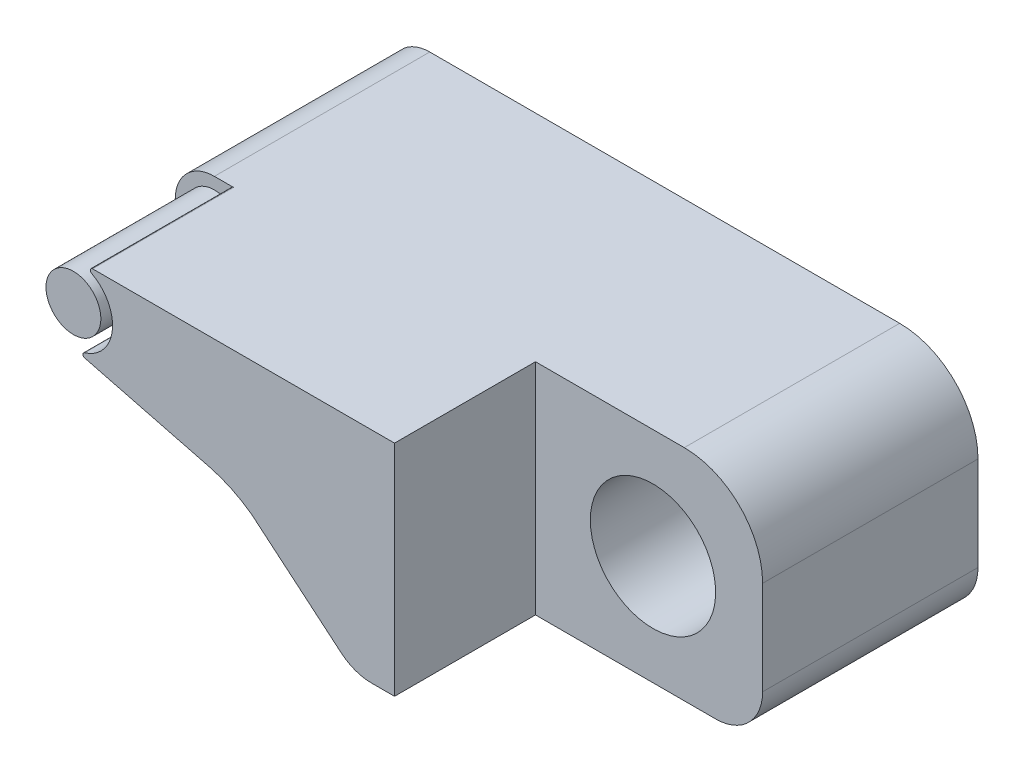
ISO-10303-21;
HEADER;
FILE_DESCRIPTION(('STEP AP214'),'2;1');
FILE_NAME('part.step','',(''),(''),'','','');
FILE_SCHEMA(('AUTOMOTIVE_DESIGN { 1 0 10303 214 1 1 1 1 }'));
ENDSEC;
DATA;
#1=APPLICATION_CONTEXT('core data for automotive mechanical design processes');
#2=APPLICATION_PROTOCOL_DEFINITION('international standard','automotive_design',2000,#1);
#3=PRODUCT_CONTEXT('',#1,'mechanical');
#4=PRODUCT('Part','Part','',(#3));
#5=PRODUCT_RELATED_PRODUCT_CATEGORY('part','',(#4));
#6=PRODUCT_DEFINITION_FORMATION('','',#4);
#7=PRODUCT_DEFINITION_CONTEXT('part definition',#1,'design');
#8=PRODUCT_DEFINITION('design','',#6,#7);
#9=PRODUCT_DEFINITION_SHAPE('','',#8);
#10=(LENGTH_UNIT() NAMED_UNIT(*) SI_UNIT(.MILLI.,.METRE.));
#11=(NAMED_UNIT(*) PLANE_ANGLE_UNIT() SI_UNIT($,.RADIAN.));
#12=(NAMED_UNIT(*) SI_UNIT($,.STERADIAN.) SOLID_ANGLE_UNIT());
#13=UNCERTAINTY_MEASURE_WITH_UNIT(LENGTH_MEASURE(1.E-05),#10,'distance_accuracy_value','');
#14=(GEOMETRIC_REPRESENTATION_CONTEXT(3) GLOBAL_UNCERTAINTY_ASSIGNED_CONTEXT((#13)) GLOBAL_UNIT_ASSIGNED_CONTEXT((#10,
#11,#12)) REPRESENTATION_CONTEXT('',''));
#15=CARTESIAN_POINT('',(0.,0.,0.));
#16=DIRECTION('',(0.,0.,1.));
#17=DIRECTION('',(1.,0.,0.));
#18=AXIS2_PLACEMENT_3D('',#15,#16,#17);
#19=CARTESIAN_POINT('',(-82.6571780570874,-15.9329559710716,-48.5));
#20=DIRECTION('',(0.,0.,1.));
#21=DIRECTION('',(-1.,0.,0.));
#22=AXIS2_PLACEMENT_3D('',#19,#20,#21);
#23=CYLINDRICAL_SURFACE('',#22,16.);
#24=DIRECTION('',(0.,0.,1.));
#25=VECTOR('',#24,1.);
#26=CARTESIAN_POINT('',(-73.2663944291931,-2.97868320668711,-48.5));
#27=LINE('',#26,#25);
#28=CARTESIAN_POINT('',(-73.2663944291931,-2.97868320668711,-27.5));
#29=VERTEX_POINT('',#28);
#30=CARTESIAN_POINT('',(-73.2663944291931,-2.9786832066871,18.));
#31=VERTEX_POINT('',#30);
#32=EDGE_CURVE('E176',#29,#31,#27,.T.);
#33=ORIENTED_EDGE('',*,*,#32,.T.);
#34=CARTESIAN_POINT('',(-82.6571780570874,-15.9329559710716,18.));
#35=DIRECTION('',(0.,0.,-1.));
#36=DIRECTION('',(-1.,0.,0.));
#37=AXIS2_PLACEMENT_3D('',#34,#35,#36);
#38=CIRCLE('',#37,16.);
#39=CARTESIAN_POINT('',(-78.6881101146584,-0.43306888540599,18.));
#40=VERTEX_POINT('',#39);
#41=EDGE_CURVE('E242',#31,#40,#38,.F.);
#42=ORIENTED_EDGE('',*,*,#41,.T.);
#43=DIRECTION('',(0.,0.,1.));
#44=VECTOR('',#43,1.);
#45=CARTESIAN_POINT('',(-78.6881101146584,-0.433068885405992,-48.5));
#46=LINE('',#45,#44);
#47=CARTESIAN_POINT('',(-78.6881101146584,-0.433068885405992,-27.5));
#48=VERTEX_POINT('',#47);
#49=EDGE_CURVE('E178',#48,#40,#46,.T.);
#50=ORIENTED_EDGE('',*,*,#49,.F.);
#51=CARTESIAN_POINT('',(-82.6571780570874,-15.9329559710716,-27.5));
#52=DIRECTION('',(0.,0.,-1.));
#53=DIRECTION('',(1.,0.,0.));
#54=AXIS2_PLACEMENT_3D('',#51,#52,#53);
#55=CIRCLE('',#54,16.);
#56=EDGE_CURVE('E164',#48,#29,#55,.T.);
#57=ORIENTED_EDGE('',*,*,#56,.T.);
#58=EDGE_LOOP('',(#33,#42,#50,#57));
#59=FACE_BOUND('',#58,.T.);
#60=ADVANCED_FACE('F45',(#59),#23,.F.);
#61=CARTESIAN_POINT('',(-55.2115879873631,-18.1284646330034,-48.5));
#62=DIRECTION('',(0.642787609686529,0.766044443118987,0.));
#63=DIRECTION('',(0.766044443118987,-0.642787609686529,0.));
#64=AXIS2_PLACEMENT_3D('',#61,#62,#63);
#65=PLANE('',#64);
#66=DIRECTION('',(0.,0.,1.));
#67=VECTOR('',#66,1.);
#68=CARTESIAN_POINT('',(-61.8046047981652,-12.5962666587139,-48.5));
#69=LINE('',#68,#67);
#70=CARTESIAN_POINT('',(-61.8046047981652,-12.5962666587139,-27.5));
#71=VERTEX_POINT('',#70);
#72=CARTESIAN_POINT('',(-61.8046047981652,-12.5962666587139,18.));
#73=VERTEX_POINT('',#72);
#74=EDGE_CURVE('E185',#71,#73,#69,.T.);
#75=ORIENTED_EDGE('',*,*,#74,.T.);
#76=DIRECTION('',(-0.766044443118987,0.642787609686528,0.));
#77=VECTOR('',#76,1.);
#78=CARTESIAN_POINT('',(-55.2115879873631,-18.1284646330034,18.));
#79=LINE('',#78,#77);
#80=EDGE_CURVE('E182',#73,#31,#79,.T.);
#81=ORIENTED_EDGE('',*,*,#80,.T.);
#82=ORIENTED_EDGE('',*,*,#32,.F.);
#83=DIRECTION('',(0.766044443118987,-0.642787609686528,0.));
#84=VECTOR('',#83,1.);
#85=CARTESIAN_POINT('',(-73.2663944291931,-2.97868320668711,-27.5));
#86=LINE('',#85,#84);
#87=EDGE_CURVE('E161',#29,#71,#86,.T.);
#88=ORIENTED_EDGE('',*,*,#87,.T.);
#89=EDGE_LOOP('',(#75,#81,#82,#88));
#90=FACE_BOUND('',#89,.T.);
#91=ADVANCED_FACE('F180',(#90),#65,.F.);
#92=CARTESIAN_POINT('',(-57.947879140046,-8.,-48.5));
#93=DIRECTION('',(0.,0.,1.));
#94=DIRECTION('',(-1.,0.,0.));
#95=AXIS2_PLACEMENT_3D('',#92,#93,#94);
#96=CYLINDRICAL_SURFACE('',#95,6.);
#97=DIRECTION('',(0.,0.,1.));
#98=VECTOR('',#97,1.);
#99=CARTESIAN_POINT('',(-57.947879140046,-14.,-48.5));
#100=LINE('',#99,#98);
#101=CARTESIAN_POINT('',(-57.947879140046,-14.,-27.5));
#102=VERTEX_POINT('',#101);
#103=CARTESIAN_POINT('',(-57.947879140046,-14.,18.));
#104=VERTEX_POINT('',#103);
#105=EDGE_CURVE('E190',#102,#104,#100,.T.);
#106=ORIENTED_EDGE('',*,*,#105,.T.);
#107=CARTESIAN_POINT('',(-57.947879140046,-8.,18.));
#108=DIRECTION('',(0.,0.,-1.));
#109=DIRECTION('',(-1.,0.,0.));
#110=AXIS2_PLACEMENT_3D('',#107,#108,#109);
#111=CIRCLE('',#110,6.);
#112=EDGE_CURVE('E308',#104,#73,#111,.T.);
#113=ORIENTED_EDGE('',*,*,#112,.T.);
#114=ORIENTED_EDGE('',*,*,#74,.F.);
#115=CARTESIAN_POINT('',(-57.947879140046,-8.,-27.5));
#116=DIRECTION('',(0.,0.,1.));
#117=DIRECTION('',(1.,0.,0.));
#118=AXIS2_PLACEMENT_3D('',#115,#116,#117);
#119=CIRCLE('',#118,6.);
#120=EDGE_CURVE('E167',#71,#102,#119,.T.);
#121=ORIENTED_EDGE('',*,*,#120,.T.);
#122=EDGE_LOOP('',(#106,#113,#114,#121));
#123=FACE_BOUND('',#122,.T.);
#124=ADVANCED_FACE('F311',(#123),#96,.T.);
#125=CARTESIAN_POINT('',(-40.,-14.,-48.5));
#126=DIRECTION('',(0.,1.,0.));
#127=DIRECTION('',(0.,0.,1.));
#128=AXIS2_PLACEMENT_3D('',#125,#126,#127);
#129=PLANE('',#128);
#130=DIRECTION('',(0.,0.,1.));
#131=VECTOR('',#130,1.);
#132=CARTESIAN_POINT('',(-32.,-14.,-48.5));
#133=LINE('',#132,#131);
#134=CARTESIAN_POINT('',(-32.,-14.,-27.5));
#135=VERTEX_POINT('',#134);
#136=CARTESIAN_POINT('',(-32.,-14.,0.));
#137=VERTEX_POINT('',#136);
#138=EDGE_CURVE('E198',#135,#137,#133,.T.);
#139=ORIENTED_EDGE('',*,*,#138,.T.);
#140=DIRECTION('',(1.,0.,0.));
#141=VECTOR('',#140,1.);
#142=CARTESIAN_POINT('',(-40.,-14.,0.));
#143=LINE('',#142,#141);
#144=CARTESIAN_POINT('',(-55.,-14.,0.));
#145=VERTEX_POINT('',#144);
#146=EDGE_CURVE('E270',#145,#137,#143,.T.);
#147=ORIENTED_EDGE('',*,*,#146,.F.);
#148=DIRECTION('',(0.,0.,-1.));
#149=VECTOR('',#148,1.);
#150=CARTESIAN_POINT('',(-55.,-14.,18.));
#151=LINE('',#150,#149);
#152=CARTESIAN_POINT('',(-55.,-14.,18.));
#153=VERTEX_POINT('',#152);
#154=EDGE_CURVE('E241',#153,#145,#151,.T.);
#155=ORIENTED_EDGE('',*,*,#154,.F.);
#156=DIRECTION('',(-1.,0.,0.));
#157=VECTOR('',#156,1.);
#158=CARTESIAN_POINT('',(-40.,-14.,18.));
#159=LINE('',#158,#157);
#160=EDGE_CURVE('E306',#153,#104,#159,.T.);
#161=ORIENTED_EDGE('',*,*,#160,.T.);
#162=ORIENTED_EDGE('',*,*,#105,.F.);
#163=DIRECTION('',(1.,0.,0.));
#164=VECTOR('',#163,1.);
#165=CARTESIAN_POINT('',(-57.947879140046,-14.,-27.5));
#166=LINE('',#165,#164);
#167=EDGE_CURVE('E591',#102,#135,#166,.T.);
#168=ORIENTED_EDGE('',*,*,#167,.T.);
#169=EDGE_LOOP('',(#139,#147,#155,#161,#162,#168));
#170=FACE_BOUND('',#169,.T.);
#171=ADVANCED_FACE('F475',(#170),#129,.F.);
#172=CARTESIAN_POINT('',(-32.,-8.,-48.5));
#173=DIRECTION('',(0.,0.,1.));
#174=DIRECTION('',(-1.,0.,0.));
#175=AXIS2_PLACEMENT_3D('',#172,#173,#174);
#176=CYLINDRICAL_SURFACE('',#175,6.);
#177=DIRECTION('',(0.,0.,1.));
#178=VECTOR('',#177,1.);
#179=CARTESIAN_POINT('',(-26.,-8.,-48.5));
#180=LINE('',#179,#178);
#181=CARTESIAN_POINT('',(-26.,-8.,-27.5));
#182=VERTEX_POINT('',#181);
#183=CARTESIAN_POINT('',(-26.,-8.,0.));
#184=VERTEX_POINT('',#183);
#185=EDGE_CURVE('E201',#182,#184,#180,.T.);
#186=ORIENTED_EDGE('',*,*,#185,.T.);
#187=CARTESIAN_POINT('',(-32.,-8.,0.));
#188=DIRECTION('',(0.,0.,-1.));
#189=DIRECTION('',(-1.,0.,0.));
#190=AXIS2_PLACEMENT_3D('',#187,#188,#189);
#191=CIRCLE('',#190,6.);
#192=EDGE_CURVE('E268',#137,#184,#191,.F.);
#193=ORIENTED_EDGE('',*,*,#192,.F.);
#194=ORIENTED_EDGE('',*,*,#138,.F.);
#195=CARTESIAN_POINT('',(-32.,-8.,-27.5));
#196=DIRECTION('',(0.,0.,1.));
#197=DIRECTION('',(1.,0.,0.));
#198=AXIS2_PLACEMENT_3D('',#195,#196,#197);
#199=CIRCLE('',#198,6.);
#200=EDGE_CURVE('E593',#135,#182,#199,.T.);
#201=ORIENTED_EDGE('',*,*,#200,.T.);
#202=EDGE_LOOP('',(#186,#193,#194,#201));
#203=FACE_BOUND('',#202,.T.);
#204=ADVANCED_FACE('F466',(#203),#176,.T.);
#205=CARTESIAN_POINT('',(-26.,0.,-48.5));
#206=DIRECTION('',(-1.,0.,0.));
#207=DIRECTION('',(0.,1.,0.));
#208=AXIS2_PLACEMENT_3D('',#205,#206,#207);
#209=PLANE('',#208);
#210=DIRECTION('',(0.,0.,1.));
#211=VECTOR('',#210,1.);
#212=CARTESIAN_POINT('',(-26.,4.,-48.5));
#213=LINE('',#212,#211);
#214=CARTESIAN_POINT('',(-26.,4.,-27.5));
#215=VERTEX_POINT('',#214);
#216=CARTESIAN_POINT('',(-26.,4.,0.));
#217=VERTEX_POINT('',#216);
#218=EDGE_CURVE('E204',#215,#217,#213,.T.);
#219=ORIENTED_EDGE('',*,*,#218,.T.);
#220=DIRECTION('',(0.,1.,0.));
#221=VECTOR('',#220,1.);
#222=CARTESIAN_POINT('',(-26.,0.,0.));
#223=LINE('',#222,#221);
#224=EDGE_CURVE('E265',#184,#217,#223,.T.);
#225=ORIENTED_EDGE('',*,*,#224,.F.);
#226=ORIENTED_EDGE('',*,*,#185,.F.);
#227=DIRECTION('',(0.,1.,0.));
#228=VECTOR('',#227,1.);
#229=CARTESIAN_POINT('',(-26.,-8.,-27.5));
#230=LINE('',#229,#228);
#231=EDGE_CURVE('E597',#182,#215,#230,.T.);
#232=ORIENTED_EDGE('',*,*,#231,.T.);
#233=EDGE_LOOP('',(#219,#225,#226,#232));
#234=FACE_BOUND('',#233,.T.);
#235=ADVANCED_FACE('F456',(#234),#209,.F.);
#236=CARTESIAN_POINT('',(-36.,4.,-48.5));
#237=DIRECTION('',(0.,0.,1.));
#238=DIRECTION('',(-1.,0.,0.));
#239=AXIS2_PLACEMENT_3D('',#236,#237,#238);
#240=CYLINDRICAL_SURFACE('',#239,10.);
#241=DIRECTION('',(0.,0.,1.));
#242=VECTOR('',#241,1.);
#243=CARTESIAN_POINT('',(-36.,14.,-48.5));
#244=LINE('',#243,#242);
#245=CARTESIAN_POINT('',(-36.,14.,-27.5));
#246=VERTEX_POINT('',#245);
#247=CARTESIAN_POINT('',(-36.,14.,0.));
#248=VERTEX_POINT('',#247);
#249=EDGE_CURVE('E207',#246,#248,#244,.T.);
#250=ORIENTED_EDGE('',*,*,#249,.T.);
#251=CARTESIAN_POINT('',(-36.,4.,0.));
#252=DIRECTION('',(0.,0.,-1.));
#253=DIRECTION('',(-1.,0.,0.));
#254=AXIS2_PLACEMENT_3D('',#251,#252,#253);
#255=CIRCLE('',#254,10.);
#256=EDGE_CURVE('E262',#217,#248,#255,.F.);
#257=ORIENTED_EDGE('',*,*,#256,.F.);
#258=ORIENTED_EDGE('',*,*,#218,.F.);
#259=CARTESIAN_POINT('',(-36.,4.,-27.5));
#260=DIRECTION('',(0.,0.,1.));
#261=DIRECTION('',(1.,0.,0.));
#262=AXIS2_PLACEMENT_3D('',#259,#260,#261);
#263=CIRCLE('',#262,10.);
#264=EDGE_CURVE('E599',#215,#246,#263,.T.);
#265=ORIENTED_EDGE('',*,*,#264,.T.);
#266=EDGE_LOOP('',(#250,#257,#258,#265));
#267=FACE_BOUND('',#266,.T.);
#268=ADVANCED_FACE('F447',(#267),#240,.T.);
#269=CARTESIAN_POINT('',(-40.,14.,-48.5));
#270=DIRECTION('',(0.,-1.,0.));
#271=DIRECTION('',(0.,0.,-1.));
#272=AXIS2_PLACEMENT_3D('',#269,#270,#271);
#273=PLANE('',#272);
#274=DIRECTION('',(0.,0.,1.));
#275=VECTOR('',#274,1.);
#276=CARTESIAN_POINT('',(-96.,14.,-48.5));
#277=LINE('',#276,#275);
#278=CARTESIAN_POINT('',(-96.,14.,-27.5));
#279=VERTEX_POINT('',#278);
#280=CARTESIAN_POINT('',(-96.,14.,0.));
#281=VERTEX_POINT('',#280);
#282=EDGE_CURVE('E210',#279,#281,#277,.T.);
#283=ORIENTED_EDGE('',*,*,#282,.T.);
#284=DIRECTION('',(-1.,0.,0.));
#285=VECTOR('',#284,1.);
#286=CARTESIAN_POINT('',(-40.,14.,0.));
#287=LINE('',#286,#285);
#288=CARTESIAN_POINT('',(-93.5505102572168,14.,0.));
#289=VERTEX_POINT('',#288);
#290=EDGE_CURVE('E226',#289,#281,#287,.T.);
#291=ORIENTED_EDGE('',*,*,#290,.F.);
#292=DIRECTION('',(0.,0.,1.));
#293=VECTOR('',#292,1.);
#294=CARTESIAN_POINT('',(-93.5505102572168,14.,0.));
#295=LINE('',#294,#293);
#296=CARTESIAN_POINT('',(-93.5505102572168,14.,18.));
#297=VERTEX_POINT('',#296);
#298=EDGE_CURVE('E228',#297,#289,#295,.F.);
#299=ORIENTED_EDGE('',*,*,#298,.F.);
#300=DIRECTION('',(1.,0.,0.));
#301=VECTOR('',#300,1.);
#302=CARTESIAN_POINT('',(-40.,14.,18.));
#303=LINE('',#302,#301);
#304=CARTESIAN_POINT('',(-55.,14.,18.));
#305=VERTEX_POINT('',#304);
#306=EDGE_CURVE('E301',#297,#305,#303,.T.);
#307=ORIENTED_EDGE('',*,*,#306,.T.);
#308=DIRECTION('',(0.,0.,-1.));
#309=VECTOR('',#308,1.);
#310=CARTESIAN_POINT('',(-55.,14.,18.));
#311=LINE('',#310,#309);
#312=CARTESIAN_POINT('',(-55.,14.,0.));
#313=VERTEX_POINT('',#312);
#314=EDGE_CURVE('E245',#305,#313,#311,.T.);
#315=ORIENTED_EDGE('',*,*,#314,.T.);
#316=DIRECTION('',(-1.,0.,0.));
#317=VECTOR('',#316,1.);
#318=CARTESIAN_POINT('',(-40.,14.,0.));
#319=LINE('',#318,#317);
#320=EDGE_CURVE('E259',#248,#313,#319,.T.);
#321=ORIENTED_EDGE('',*,*,#320,.F.);
#322=ORIENTED_EDGE('',*,*,#249,.F.);
#323=DIRECTION('',(-1.,0.,0.));
#324=VECTOR('',#323,1.);
#325=CARTESIAN_POINT('',(-36.,14.,-27.5));
#326=LINE('',#325,#324);
#327=EDGE_CURVE('E293',#246,#279,#326,.T.);
#328=ORIENTED_EDGE('',*,*,#327,.T.);
#329=EDGE_LOOP('',(#283,#291,#299,#307,#315,#321,#322,#328));
#330=FACE_BOUND('',#329,.T.);
#331=ADVANCED_FACE('F438',(#330),#273,.F.);
#332=CARTESIAN_POINT('',(-96.,9.,-48.5));
#333=DIRECTION('',(0.,0.,1.));
#334=DIRECTION('',(-1.,0.,0.));
#335=AXIS2_PLACEMENT_3D('',#332,#333,#334);
#336=CYLINDRICAL_SURFACE('',#335,5.);
#337=DIRECTION('',(0.,0.,1.));
#338=VECTOR('',#337,1.);
#339=CARTESIAN_POINT('',(-96.,4.,-48.5));
#340=LINE('',#339,#338);
#341=CARTESIAN_POINT('',(-96.,4.,-27.5));
#342=VERTEX_POINT('',#341);
#343=CARTESIAN_POINT('',(-96.,4.,0.));
#344=VERTEX_POINT('',#343);
#345=EDGE_CURVE('E213',#342,#344,#340,.T.);
#346=ORIENTED_EDGE('',*,*,#345,.T.);
#347=CARTESIAN_POINT('',(-96.,9.,0.));
#348=DIRECTION('',(0.,0.,-1.));
#349=DIRECTION('',(-1.,0.,0.));
#350=AXIS2_PLACEMENT_3D('',#347,#348,#349);
#351=CIRCLE('',#350,5.);
#352=EDGE_CURVE('E237',#344,#281,#351,.T.);
#353=ORIENTED_EDGE('',*,*,#352,.T.);
#354=ORIENTED_EDGE('',*,*,#282,.F.);
#355=CARTESIAN_POINT('',(-96.,9.,-27.5));
#356=DIRECTION('',(0.,0.,1.));
#357=DIRECTION('',(1.,0.,0.));
#358=AXIS2_PLACEMENT_3D('',#355,#356,#357);
#359=CIRCLE('',#358,5.);
#360=EDGE_CURVE('E290',#279,#342,#359,.T.);
#361=ORIENTED_EDGE('',*,*,#360,.T.);
#362=EDGE_LOOP('',(#346,#353,#354,#361));
#363=FACE_BOUND('',#362,.T.);
#364=ADVANCED_FACE('F431',(#363),#336,.T.);
#365=CARTESIAN_POINT('',(-42.4848265578072,-9.70367139895937,-48.5));
#366=DIRECTION('',(0.248066746401812,0.968742942854098,0.));
#367=DIRECTION('',(0.968742942854098,-0.248066746401812,0.));
#368=AXIS2_PLACEMENT_3D('',#365,#366,#367);
#369=PLANE('',#368);
#370=ORIENTED_EDGE('',*,*,#49,.T.);
#371=DIRECTION('',(-0.968742942854099,0.248066746401812,0.));
#372=VECTOR('',#371,1.);
#373=CARTESIAN_POINT('',(-42.4848265578072,-9.70367139895937,18.));
#374=LINE('',#373,#372);
#375=CARTESIAN_POINT('',(-94.5583593100935,3.63083796577454,18.));
#376=VERTEX_POINT('',#375);
#377=EDGE_CURVE('E239',#40,#376,#374,.T.);
#378=ORIENTED_EDGE('',*,*,#377,.T.);
#379=DIRECTION('',(0.,0.,1.));
#380=VECTOR('',#379,1.);
#381=CARTESIAN_POINT('',(-94.5583593100935,3.63083796577454,18.));
#382=LINE('',#381,#380);
#383=CARTESIAN_POINT('',(-94.5583593100935,3.63083796577454,0.));
#384=VERTEX_POINT('',#383);
#385=EDGE_CURVE('E218',#384,#376,#382,.T.);
#386=ORIENTED_EDGE('',*,*,#385,.F.);
#387=DIRECTION('',(0.968742942854098,-0.248066746401812,0.));
#388=VECTOR('',#387,1.);
#389=CARTESIAN_POINT('',(-42.4848265578072,-9.70367139895937,0.));
#390=LINE('',#389,#388);
#391=EDGE_CURVE('E61',#344,#384,#390,.T.);
#392=ORIENTED_EDGE('',*,*,#391,.F.);
#393=ORIENTED_EDGE('',*,*,#345,.F.);
#394=DIRECTION('',(0.968742942854098,-0.248066746401812,0.));
#395=VECTOR('',#394,1.);
#396=CARTESIAN_POINT('',(-96.,4.,-27.5));
#397=LINE('',#396,#395);
#398=EDGE_CURVE('E287',#342,#48,#397,.T.);
#399=ORIENTED_EDGE('',*,*,#398,.T.);
#400=EDGE_LOOP('',(#370,#378,#386,#392,#393,#399));
#401=FACE_BOUND('',#400,.T.);
#402=ADVANCED_FACE('F238',(#401),#369,.F.);
#403=CARTESIAN_POINT('',(-40.,0.,-48.5));
#404=DIRECTION('',(0.,0.,1.));
#405=DIRECTION('',(-1.,0.,0.));
#406=AXIS2_PLACEMENT_3D('',#403,#404,#405);
#407=CYLINDRICAL_SURFACE('',#406,8.);
#408=CARTESIAN_POINT('',(-40.,0.,0.));
#409=DIRECTION('',(0.,0.,-1.));
#410=DIRECTION('',(-1.,0.,0.));
#411=AXIS2_PLACEMENT_3D('',#408,#409,#410);
#412=CIRCLE('',#411,8.);
#413=CARTESIAN_POINT('',(-48.,0.,0.));
#414=VERTEX_POINT('',#413);
#415=EDGE_CURVE('E193',#414,#414,#412,.T.);
#416=ORIENTED_EDGE('',*,*,#415,.F.);
#417=EDGE_LOOP('',(#416));
#418=FACE_BOUND('',#417,.T.);
#419=CARTESIAN_POINT('',(-40.,0.,-18.));
#420=DIRECTION('',(0.,0.,1.));
#421=DIRECTION('',(1.,0.,0.));
#422=AXIS2_PLACEMENT_3D('',#419,#420,#421);
#423=CIRCLE('',#422,8.);
#424=CARTESIAN_POINT('',(-32.,0.,-18.));
#425=VERTEX_POINT('',#424);
#426=EDGE_CURVE('E49',#425,#425,#423,.F.);
#427=ORIENTED_EDGE('',*,*,#426,.T.);
#428=EDGE_LOOP('',(#427));
#429=FACE_BOUND('',#428,.T.);
#430=ADVANCED_FACE('F279',(#418,#429),#407,.F.);
#431=CARTESIAN_POINT('',(-40.,0.,0.));
#432=DIRECTION('',(0.,0.,1.));
#433=DIRECTION('',(-1.,0.,0.));
#434=AXIS2_PLACEMENT_3D('',#431,#432,#433);
#435=PLANE('',#434);
#436=CARTESIAN_POINT('',(-96.,9.,0.));
#437=DIRECTION('',(0.,0.,-1.));
#438=DIRECTION('',(-1.,0.,0.));
#439=AXIS2_PLACEMENT_3D('',#436,#437,#438);
#440=CIRCLE('',#439,3.5);
#441=CARTESIAN_POINT('',(-99.5,9.,0.));
#442=VERTEX_POINT('',#441);
#443=EDGE_CURVE('E286',#442,#442,#440,.T.);
#444=ORIENTED_EDGE('',*,*,#443,.T.);
#445=EDGE_LOOP('',(#444));
#446=FACE_BOUND('',#445,.T.);
#447=ORIENTED_EDGE('',*,*,#352,.F.);
#448=ORIENTED_EDGE('',*,*,#391,.T.);
#449=CARTESIAN_POINT('',(-94.4839392861729,3.92146084863077,0.));
#450=DIRECTION('',(0.,0.,-1.));
#451=DIRECTION('',(-1.,0.,0.));
#452=AXIS2_PLACEMENT_3D('',#449,#450,#451);
#453=CIRCLE('',#452,0.3);
#454=CARTESIAN_POINT('',(-94.5697540435594,4.20892532889695,0.));
#455=VERTEX_POINT('',#454);
#456=EDGE_CURVE('E54',#455,#384,#453,.F.);
#457=ORIENTED_EDGE('',*,*,#456,.F.);
#458=CARTESIAN_POINT('',(-96.,9.,0.));
#459=DIRECTION('',(0.,0.,-1.));
#460=DIRECTION('',(-1.,0.,0.));
#461=AXIS2_PLACEMENT_3D('',#458,#459,#460);
#462=CIRCLE('',#461,5.);
#463=CARTESIAN_POINT('',(-93.6891606200159,13.4339622641509,0.));
#464=VERTEX_POINT('',#463);
#465=EDGE_CURVE('E250',#464,#455,#462,.T.);
#466=ORIENTED_EDGE('',*,*,#465,.F.);
#467=CARTESIAN_POINT('',(-93.5505102572168,13.7,0.));
#468=DIRECTION('',(0.,0.,-1.));
#469=DIRECTION('',(-1.,0.,0.));
#470=AXIS2_PLACEMENT_3D('',#467,#468,#469);
#471=CIRCLE('',#470,0.3);
#472=EDGE_CURVE('E11',#289,#464,#471,.F.);
#473=ORIENTED_EDGE('',*,*,#472,.F.);
#474=ORIENTED_EDGE('',*,*,#290,.T.);
#475=EDGE_LOOP('',(#447,#448,#457,#466,#473,#474));
#476=FACE_BOUND('',#475,.T.);
#477=ADVANCED_FACE('F236',(#446,#476),#435,.T.);
#478=DIRECTION('',(0.,-1.,0.));
#479=VECTOR('',#478,1.);
#480=CARTESIAN_POINT('',(-55.,0.,0.));
#481=LINE('',#480,#479);
#482=EDGE_CURVE('E252',#313,#145,#481,.T.);
#483=ORIENTED_EDGE('',*,*,#482,.T.);
#484=ORIENTED_EDGE('',*,*,#146,.T.);
#485=ORIENTED_EDGE('',*,*,#192,.T.);
#486=ORIENTED_EDGE('',*,*,#224,.T.);
#487=ORIENTED_EDGE('',*,*,#256,.T.);
#488=ORIENTED_EDGE('',*,*,#320,.T.);
#489=EDGE_LOOP('',(#483,#484,#485,#486,#487,#488));
#490=FACE_BOUND('',#489,.T.);
#491=ORIENTED_EDGE('',*,*,#415,.T.);
#492=EDGE_LOOP('',(#491));
#493=FACE_BOUND('',#492,.T.);
#494=ADVANCED_FACE('F277',(#490,#493),#435,.T.);
#495=CARTESIAN_POINT('',(-96.,9.,18.));
#496=DIRECTION('',(0.,0.,-1.));
#497=DIRECTION('',(1.,0.,0.));
#498=AXIS2_PLACEMENT_3D('',#495,#496,#497);
#499=CYLINDRICAL_SURFACE('',#498,5.);
#500=CARTESIAN_POINT('',(-96.,9.,18.));
#501=DIRECTION('',(0.,0.,-1.));
#502=DIRECTION('',(-1.,0.,0.));
#503=AXIS2_PLACEMENT_3D('',#500,#501,#502);
#504=CIRCLE('',#503,5.);
#505=CARTESIAN_POINT('',(-93.6891606200159,13.4339622641509,18.));
#506=VERTEX_POINT('',#505);
#507=CARTESIAN_POINT('',(-94.5697540435594,4.20892532889695,18.));
#508=VERTEX_POINT('',#507);
#509=EDGE_CURVE('E254',#506,#508,#504,.T.);
#510=ORIENTED_EDGE('',*,*,#509,.F.);
#511=DIRECTION('',(0.,0.,-1.));
#512=VECTOR('',#511,1.);
#513=CARTESIAN_POINT('',(-93.6891606200159,13.4339622641509,18.));
#514=LINE('',#513,#512);
#515=EDGE_CURVE('E184',#464,#506,#514,.F.);
#516=ORIENTED_EDGE('',*,*,#515,.F.);
#517=ORIENTED_EDGE('',*,*,#465,.T.);
#518=DIRECTION('',(0.,0.,-1.));
#519=VECTOR('',#518,1.);
#520=CARTESIAN_POINT('',(-94.5697540435594,4.20892532889695,18.));
#521=LINE('',#520,#519);
#522=EDGE_CURVE('E188',#508,#455,#521,.T.);
#523=ORIENTED_EDGE('',*,*,#522,.F.);
#524=EDGE_LOOP('',(#510,#516,#517,#523));
#525=FACE_BOUND('',#524,.T.);
#526=ADVANCED_FACE('F326',(#525),#499,.F.);
#527=CARTESIAN_POINT('',(-55.,0.,18.));
#528=DIRECTION('',(-1.,0.,0.));
#529=DIRECTION('',(0.,1.,0.));
#530=AXIS2_PLACEMENT_3D('',#527,#528,#529);
#531=PLANE('',#530);
#532=ORIENTED_EDGE('',*,*,#482,.F.);
#533=ORIENTED_EDGE('',*,*,#314,.F.);
#534=DIRECTION('',(0.,-1.,0.));
#535=VECTOR('',#534,1.);
#536=CARTESIAN_POINT('',(-55.,0.,18.));
#537=LINE('',#536,#535);
#538=EDGE_CURVE('E304',#305,#153,#537,.T.);
#539=ORIENTED_EDGE('',*,*,#538,.T.);
#540=ORIENTED_EDGE('',*,*,#154,.T.);
#541=EDGE_LOOP('',(#532,#533,#539,#540));
#542=FACE_BOUND('',#541,.T.);
#543=ADVANCED_FACE('F317',(#542),#531,.F.);
#544=CARTESIAN_POINT('',(-40.,0.,18.));
#545=DIRECTION('',(0.,0.,1.));
#546=DIRECTION('',(-1.,0.,0.));
#547=AXIS2_PLACEMENT_3D('',#544,#545,#546);
#548=PLANE('',#547);
#549=ORIENTED_EDGE('',*,*,#377,.F.);
#550=ORIENTED_EDGE('',*,*,#41,.F.);
#551=ORIENTED_EDGE('',*,*,#80,.F.);
#552=ORIENTED_EDGE('',*,*,#112,.F.);
#553=ORIENTED_EDGE('',*,*,#160,.F.);
#554=ORIENTED_EDGE('',*,*,#538,.F.);
#555=ORIENTED_EDGE('',*,*,#306,.F.);
#556=CARTESIAN_POINT('',(-93.5505102572168,13.7,18.));
#557=DIRECTION('',(0.,0.,-1.));
#558=DIRECTION('',(-1.,0.,0.));
#559=AXIS2_PLACEMENT_3D('',#556,#557,#558);
#560=CIRCLE('',#559,0.3);
#561=EDGE_CURVE('E222',#506,#297,#560,.T.);
#562=ORIENTED_EDGE('',*,*,#561,.F.);
#563=ORIENTED_EDGE('',*,*,#509,.T.);
#564=CARTESIAN_POINT('',(-94.4839392861729,3.92146084863077,18.));
#565=DIRECTION('',(0.,0.,-1.));
#566=DIRECTION('',(-1.,0.,0.));
#567=AXIS2_PLACEMENT_3D('',#564,#565,#566);
#568=CIRCLE('',#567,0.3);
#569=EDGE_CURVE('E224',#376,#508,#568,.T.);
#570=ORIENTED_EDGE('',*,*,#569,.F.);
#571=EDGE_LOOP('',(#549,#550,#551,#552,#553,#554,#555,#562,#563,#570));
#572=FACE_BOUND('',#571,.T.);
#573=ADVANCED_FACE('F314',(#572),#548,.T.);
#574=CARTESIAN_POINT('',(-96.,9.,18.));
#575=DIRECTION('',(0.,0.,-1.));
#576=DIRECTION('',(1.,0.,0.));
#577=AXIS2_PLACEMENT_3D('',#574,#575,#576);
#578=CYLINDRICAL_SURFACE('',#577,3.5);
#579=CARTESIAN_POINT('',(-96.,9.,18.));
#580=DIRECTION('',(0.,0.,-1.));
#581=DIRECTION('',(-1.,0.,0.));
#582=AXIS2_PLACEMENT_3D('',#579,#580,#581);
#583=CIRCLE('',#582,3.5);
#584=CARTESIAN_POINT('',(-99.5,9.,18.));
#585=VERTEX_POINT('',#584);
#586=EDGE_CURVE('E253',#585,#585,#583,.T.);
#587=ORIENTED_EDGE('',*,*,#586,.T.);
#588=EDGE_LOOP('',(#587));
#589=FACE_BOUND('',#588,.T.);
#590=ORIENTED_EDGE('',*,*,#443,.F.);
#591=EDGE_LOOP('',(#590));
#592=FACE_BOUND('',#591,.T.);
#593=ADVANCED_FACE('F316',(#589,#592),#578,.T.);
#594=CARTESIAN_POINT('',(-40.,0.,18.));
#595=DIRECTION('',(0.,0.,1.));
#596=DIRECTION('',(-1.,0.,0.));
#597=AXIS2_PLACEMENT_3D('',#594,#595,#596);
#598=PLANE('',#597);
#599=ORIENTED_EDGE('',*,*,#586,.F.);
#600=EDGE_LOOP('',(#599));
#601=FACE_BOUND('',#600,.T.);
#602=ADVANCED_FACE('F323',(#601),#598,.T.);
#603=CARTESIAN_POINT('',(-94.4839392861729,3.92146084863077,18.));
#604=DIRECTION('',(0.,0.,-1.));
#605=DIRECTION('',(1.,0.,0.));
#606=AXIS2_PLACEMENT_3D('',#603,#604,#605);
#607=CYLINDRICAL_SURFACE('',#606,0.3);
#608=ORIENTED_EDGE('',*,*,#569,.T.);
#609=ORIENTED_EDGE('',*,*,#522,.T.);
#610=ORIENTED_EDGE('',*,*,#456,.T.);
#611=ORIENTED_EDGE('',*,*,#385,.T.);
#612=EDGE_LOOP('',(#608,#609,#610,#611));
#613=FACE_BOUND('',#612,.T.);
#614=ADVANCED_FACE('F232',(#613),#607,.T.);
#615=CARTESIAN_POINT('',(-93.5505102572168,13.7,18.));
#616=DIRECTION('',(0.,0.,-1.));
#617=DIRECTION('',(1.,0.,0.));
#618=AXIS2_PLACEMENT_3D('',#615,#616,#617);
#619=CYLINDRICAL_SURFACE('',#618,0.3);
#620=ORIENTED_EDGE('',*,*,#561,.T.);
#621=ORIENTED_EDGE('',*,*,#298,.T.);
#622=ORIENTED_EDGE('',*,*,#472,.T.);
#623=ORIENTED_EDGE('',*,*,#515,.T.);
#624=EDGE_LOOP('',(#620,#621,#622,#623));
#625=FACE_BOUND('',#624,.T.);
#626=ADVANCED_FACE('F47',(#625),#619,.T.);
#627=CARTESIAN_POINT('',(-82.6571780570874,-15.9329559710716,-18.));
#628=DIRECTION('',(0.,0.,-1.));
#629=DIRECTION('',(1.,0.,0.));
#630=AXIS2_PLACEMENT_3D('',#627,#628,#629);
#631=PLANE('',#630);
#632=ORIENTED_EDGE('',*,*,#426,.F.);
#633=EDGE_LOOP('',(#632));
#634=FACE_BOUND('',#633,.T.);
#635=ADVANCED_FACE('F342',(#634),#631,.F.);
#636=CARTESIAN_POINT('',(-82.6571780570874,-15.9329559710716,-27.5));
#637=DIRECTION('',(0.,0.,-1.));
#638=DIRECTION('',(1.,0.,0.));
#639=AXIS2_PLACEMENT_3D('',#636,#637,#638);
#640=PLANE('',#639);
#641=ORIENTED_EDGE('',*,*,#56,.F.);
#642=ORIENTED_EDGE('',*,*,#398,.F.);
#643=ORIENTED_EDGE('',*,*,#360,.F.);
#644=ORIENTED_EDGE('',*,*,#327,.F.);
#645=ORIENTED_EDGE('',*,*,#264,.F.);
#646=ORIENTED_EDGE('',*,*,#231,.F.);
#647=ORIENTED_EDGE('',*,*,#200,.F.);
#648=ORIENTED_EDGE('',*,*,#167,.F.);
#649=ORIENTED_EDGE('',*,*,#120,.F.);
#650=ORIENTED_EDGE('',*,*,#87,.F.);
#651=EDGE_LOOP('',(#641,#642,#643,#644,#645,#646,#647,#648,#649,#650));
#652=FACE_BOUND('',#651,.T.);
#653=ADVANCED_FACE('F163',(#652),#640,.T.);
#654=CLOSED_SHELL('',(#60,#91,#124,#171,#204,#235,#268,#331,#364,#402,#430,#477,#494,#526,#543,
#573,#593,#602,#614,#626,#635,#653));
#655=MANIFOLD_SOLID_BREP('B2',#654);
#656=ADVANCED_BREP_SHAPE_REPRESENTATION('',(#18,#655),#14);
#657=SHAPE_DEFINITION_REPRESENTATION(#9,#656);
ENDSEC;
END-ISO-10303-21;
